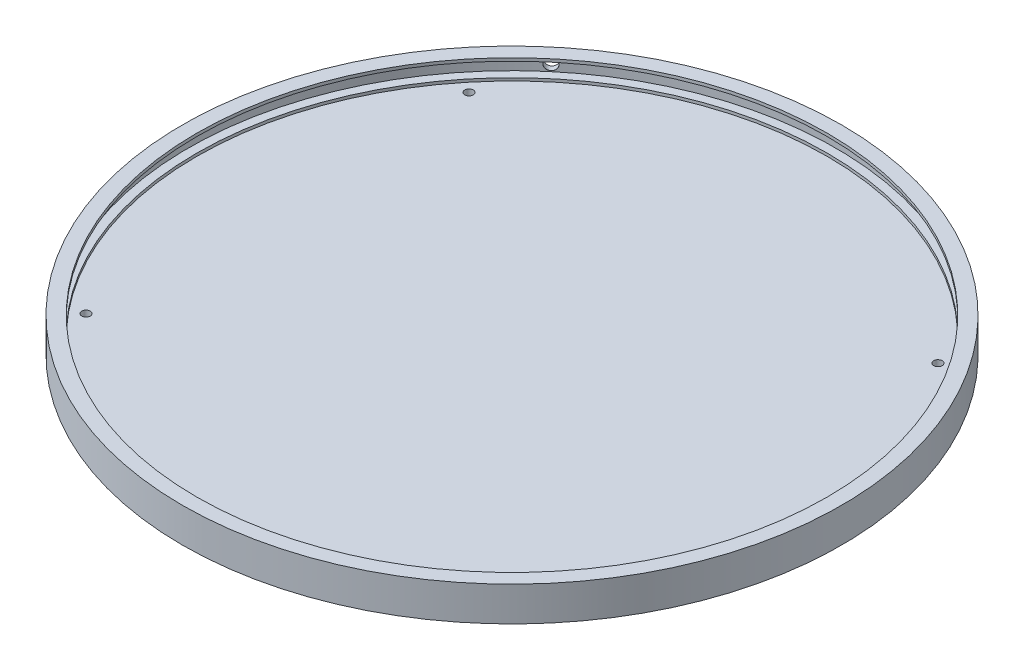
ISO-10303-21;
HEADER;
FILE_DESCRIPTION(('STEP AP214'),'2;1');
FILE_NAME('part.step','',(''),(''),'','','');
FILE_SCHEMA(('AUTOMOTIVE_DESIGN { 1 0 10303 214 1 1 1 1 }'));
ENDSEC;
DATA;
#1=APPLICATION_CONTEXT('core data for automotive mechanical design processes');
#2=APPLICATION_PROTOCOL_DEFINITION('international standard','automotive_design',2000,#1);
#3=PRODUCT_CONTEXT('',#1,'mechanical');
#4=PRODUCT('Part','Part','',(#3));
#5=PRODUCT_RELATED_PRODUCT_CATEGORY('part','',(#4));
#6=PRODUCT_DEFINITION_FORMATION('','',#4);
#7=PRODUCT_DEFINITION_CONTEXT('part definition',#1,'design');
#8=PRODUCT_DEFINITION('design','',#6,#7);
#9=PRODUCT_DEFINITION_SHAPE('','',#8);
#10=(LENGTH_UNIT() NAMED_UNIT(*) SI_UNIT(.MILLI.,.METRE.));
#11=(NAMED_UNIT(*) PLANE_ANGLE_UNIT() SI_UNIT($,.RADIAN.));
#12=(NAMED_UNIT(*) SI_UNIT($,.STERADIAN.) SOLID_ANGLE_UNIT());
#13=UNCERTAINTY_MEASURE_WITH_UNIT(LENGTH_MEASURE(1.E-05),#10,'distance_accuracy_value','');
#14=(GEOMETRIC_REPRESENTATION_CONTEXT(3) GLOBAL_UNCERTAINTY_ASSIGNED_CONTEXT((#13)) GLOBAL_UNIT_ASSIGNED_CONTEXT((#10,
#11,#12)) REPRESENTATION_CONTEXT('',''));
#15=CARTESIAN_POINT('',(0.,0.,0.));
#16=DIRECTION('',(0.,0.,1.));
#17=DIRECTION('',(1.,0.,0.));
#18=AXIS2_PLACEMENT_3D('',#15,#16,#17);
#19=CARTESIAN_POINT('',(0.,12.0332613302071,0.));
#20=DIRECTION('',(0.,-1.,0.));
#21=DIRECTION('',(0.,0.,-1.));
#22=AXIS2_PLACEMENT_3D('',#19,#20,#21);
#23=CYLINDRICAL_SURFACE('',#22,110.);
#24=CARTESIAN_POINT('',(0.,5.,0.));
#25=DIRECTION('',(0.,1.,0.));
#26=DIRECTION('',(0.,0.,1.));
#27=AXIS2_PLACEMENT_3D('',#24,#25,#26);
#28=CIRCLE('',#27,110.);
#29=CARTESIAN_POINT('',(0.,5.,110.));
#30=VERTEX_POINT('',#29);
#31=EDGE_CURVE('E12',#30,#30,#28,.T.);
#32=ORIENTED_EDGE('',*,*,#31,.F.);
#33=EDGE_LOOP('',(#32));
#34=FACE_BOUND('',#33,.T.);
#35=CARTESIAN_POINT('',(0.,6.,0.));
#36=DIRECTION('',(0.,1.,0.));
#37=DIRECTION('',(0.,0.,1.));
#38=AXIS2_PLACEMENT_3D('',#35,#36,#37);
#39=CIRCLE('',#38,110.);
#40=CARTESIAN_POINT('',(0.,6.,110.));
#41=VERTEX_POINT('',#40);
#42=EDGE_CURVE('E131',#41,#41,#39,.T.);
#43=ORIENTED_EDGE('',*,*,#42,.T.);
#44=EDGE_LOOP('',(#43));
#45=FACE_BOUND('',#44,.T.);
#46=ADVANCED_FACE('F50',(#34,#45),#23,.F.);
#47=CARTESIAN_POINT('',(0.,11.,0.));
#48=DIRECTION('',(0.,1.,0.));
#49=DIRECTION('',(0.,0.,1.));
#50=AXIS2_PLACEMENT_3D('',#47,#48,#49);
#51=CIRCLE('',#50,110.);
#52=CARTESIAN_POINT('',(0.,11.,110.));
#53=VERTEX_POINT('',#52);
#54=EDGE_CURVE('E134',#53,#53,#51,.T.);
#55=ORIENTED_EDGE('',*,*,#54,.F.);
#56=EDGE_LOOP('',(#55));
#57=FACE_BOUND('',#56,.T.);
#58=CARTESIAN_POINT('',(0.,12.0332613302071,0.));
#59=DIRECTION('',(0.,1.,0.));
#60=DIRECTION('',(0.,0.,1.));
#61=AXIS2_PLACEMENT_3D('',#58,#59,#60);
#62=CIRCLE('',#61,110.);
#63=CARTESIAN_POINT('',(0.,12.0332613302071,110.));
#64=VERTEX_POINT('',#63);
#65=EDGE_CURVE('E146',#64,#64,#62,.T.);
#66=ORIENTED_EDGE('',*,*,#65,.T.);
#67=EDGE_LOOP('',(#66));
#68=FACE_BOUND('',#67,.T.);
#69=ADVANCED_FACE('F52',(#57,#68),#23,.F.);
#70=CARTESIAN_POINT('',(0.,12.0332613302071,0.));
#71=DIRECTION('',(0.,-1.,0.));
#72=DIRECTION('',(0.,0.,-1.));
#73=AXIS2_PLACEMENT_3D('',#70,#71,#72);
#74=CYLINDRICAL_SURFACE('',#73,115.);
#75=CARTESIAN_POINT('',(-72.5635949649901,8.29805204726436,-89.2161682978868));
#76=CARTESIAN_POINT('',(-72.5635989235966,8.41038381068899,-89.2161652694946));
#77=CARTESIAN_POINT('',(-72.570963463125,8.52279680903081,-89.2101767274284));
#78=CARTESIAN_POINT('',(-72.6002307960804,8.74452626790636,-89.1863601151986));
#79=CARTESIAN_POINT('',(-72.6221510438443,8.8538388463064,-89.1685178307214));
#80=CARTESIAN_POINT('',(-72.6798788584181,9.06612311536384,-89.1214709692371));
#81=CARTESIAN_POINT('',(-72.715679738066,9.1690978317243,-89.0922718634944));
#82=CARTESIAN_POINT('',(-72.8001030018828,9.36580199428538,-89.0233000935605));
#83=CARTESIAN_POINT('',(-72.8487222174628,9.45953371742233,-88.9835300424016));
#84=CARTESIAN_POINT('',(-72.9573674624024,9.63514368314188,-88.8944736912287));
#85=CARTESIAN_POINT('',(-73.0173957611737,9.71701956172777,-88.8451854979038));
#86=CARTESIAN_POINT('',(-73.1470983020891,9.86657422343615,-88.73843051225));
#87=CARTESIAN_POINT('',(-73.216772924644,9.93425244639733,-88.680963397376));
#88=CARTESIAN_POINT('',(-73.3637407365249,10.0534897237456,-88.5594186119919));
#89=CARTESIAN_POINT('',(-73.4410342663039,10.1050480573809,-88.4953406460681));
#90=CARTESIAN_POINT('',(-73.6009993860438,10.1905770204827,-88.3623432112762));
#91=CARTESIAN_POINT('',(-73.6836709615802,10.2245476971185,-88.2934237553932));
#92=CARTESIAN_POINT('',(-73.852005731904,10.2739338756188,-88.1526702863767));
#93=CARTESIAN_POINT('',(-73.9376686247584,10.2893512446499,-88.0808365672808));
#94=CARTESIAN_POINT('',(-74.1095469782745,10.3011988917976,-87.9362704200492));
#95=CARTESIAN_POINT('',(-74.1957624375337,10.297629218091,-87.8635379941942));
#96=CARTESIAN_POINT('',(-74.3662923001249,10.2716057613346,-87.7192512880254));
#97=CARTESIAN_POINT('',(-74.4506069074992,10.2491540151413,-87.6476968814845));
#98=CARTESIAN_POINT('',(-74.6149726766387,10.1860068745975,-87.5078139745733));
#99=CARTESIAN_POINT('',(-74.6950238322612,10.1453114539624,-87.4394854788509));
#100=CARTESIAN_POINT('',(-74.8486314681472,10.04682983828,-87.30803284228));
#101=CARTESIAN_POINT('',(-74.9221875932126,9.98904270927773,-87.2449089860737));
#102=CARTESIAN_POINT('',(-75.0607607281884,9.85801878336727,-87.1257170173518));
#103=CARTESIAN_POINT('',(-75.125777733833,9.78478197874141,-87.0696489083608));
#104=CARTESIAN_POINT('',(-75.2454892629179,9.6249260837371,-86.9662153891914));
#105=CARTESIAN_POINT('',(-75.3001824170989,9.53830522098897,-86.9188511334328));
#106=CARTESIAN_POINT('',(-75.3977362843162,9.35414635305779,-86.8342417860159));
#107=CARTESIAN_POINT('',(-75.4405969956926,9.25660834634338,-86.7969966957771));
#108=CARTESIAN_POINT('',(-75.5133160288148,9.05338301507061,-86.733738744921));
#109=CARTESIAN_POINT('',(-75.5431743096194,8.94769566485346,-86.7077259196711));
#110=CARTESIAN_POINT('',(-75.5890754854831,8.73117222153215,-86.667713724728));
#111=CARTESIAN_POINT('',(-75.6051183935978,8.62033613329366,-86.6537143436822));
#112=CARTESIAN_POINT('',(-75.6229517544795,8.39667706107066,-86.6381515914718));
#113=CARTESIAN_POINT('',(-75.6247440745613,8.28385433934493,-86.6365865909777));
#114=CARTESIAN_POINT('',(-75.6140325175079,8.05941101329623,-86.6459354790611));
#115=CARTESIAN_POINT('',(-75.6015286455074,7.94779040854152,-86.6568493631566));
#116=CARTESIAN_POINT('',(-75.5625655069265,7.72892676984514,-86.6908262459352));
#117=CARTESIAN_POINT('',(-75.536107087094,7.62168347071838,-86.7138885074671));
#118=CARTESIAN_POINT('',(-75.4699549162047,7.41461061733282,-86.7714689100171));
#119=CARTESIAN_POINT('',(-75.430261157327,7.31478106745496,-86.8059870578046));
#120=CARTESIAN_POINT('',(-75.3387158028832,7.12535813659385,-86.8854508036189));
#121=CARTESIAN_POINT('',(-75.286862940309,7.03576582380348,-86.9303974883194));
#122=CARTESIAN_POINT('',(-75.1724210924742,6.86937130822063,-87.0293790358896));
#123=CARTESIAN_POINT('',(-75.1098320951295,6.7925691198241,-87.0834139089885));
#124=CARTESIAN_POINT('',(-74.9756328820637,6.65392678979911,-87.1989810785048));
#125=CARTESIAN_POINT('',(-74.9040217029311,6.59208824808918,-87.2605141755784));
#126=CARTESIAN_POINT('',(-74.7537663914675,6.48513958541108,-87.3892681394775));
#127=CARTESIAN_POINT('',(-74.6751222693986,6.44002944003402,-87.4564889980036));
#128=CARTESIAN_POINT('',(-74.5129985966574,6.36782085625959,-87.5946595056729));
#129=CARTESIAN_POINT('',(-74.4295193264602,6.34072137424307,-87.6656089385085));
#130=CARTESIAN_POINT('',(-74.2600660212105,6.30529993731935,-87.8091961166282));
#131=CARTESIAN_POINT('',(-74.1740919839068,6.2969779993575,-87.8818338634358));
#132=CARTESIAN_POINT('',(-74.0020941748441,6.29934805671065,-88.0267158305666));
#133=CARTESIAN_POINT('',(-73.9160704112714,6.31003751006908,-88.0989601022048));
#134=CARTESIAN_POINT('',(-73.7464136542782,6.35012173144914,-88.241026286566));
#135=CARTESIAN_POINT('',(-73.6627806656448,6.37951653692109,-88.3108481944389));
#136=CARTESIAN_POINT('',(-73.5003049925301,6.4561771527932,-88.4461211718779));
#137=CARTESIAN_POINT('',(-73.4214623954848,6.50344328927355,-88.5115721616665));
#138=CARTESIAN_POINT('',(-73.2708502357115,6.6145026323688,-88.6362909779077));
#139=CARTESIAN_POINT('',(-73.1990804027862,6.67829520729414,-88.6955590405686));
#140=CARTESIAN_POINT('',(-73.0646947761076,6.82059893412094,-88.8062946692415));
#141=CARTESIAN_POINT('',(-73.0020792322821,6.89911048774201,-88.8577620222823));
#142=CARTESIAN_POINT('',(-72.8878202300001,7.06864864136574,-88.9515100500556));
#143=CARTESIAN_POINT('',(-72.8361794990318,7.15967834317367,-88.9937884411832));
#144=CARTESIAN_POINT('',(-72.7453842025782,7.35169124324113,-89.0680219231043));
#145=CARTESIAN_POINT('',(-72.7062363273568,7.4526797369391,-89.0999714826466));
#146=CARTESIAN_POINT('',(-72.6416554112652,7.66162831659262,-89.1526312113996));
#147=CARTESIAN_POINT('',(-72.6162059581192,7.76957988546883,-89.1733548307611));
#148=CARTESIAN_POINT('',(-72.5865450193335,7.94818985035567,-89.1974981851991));
#149=CARTESIAN_POINT('',(-72.5779498987048,8.01768808814614,-89.2044911658375));
#150=CARTESIAN_POINT('',(-72.5664736329422,8.15746429141074,-89.2138271697081));
#151=CARTESIAN_POINT('',(-72.5635924872511,8.22774225680884,-89.2161701933937));
#152=CARTESIAN_POINT('',(-72.5635949649901,8.29805204726436,-89.2161682978868));
#153=B_SPLINE_CURVE_WITH_KNOTS('',3,(#75,#76,#77,#78,#79,#80,#81,#82,#83,#84,#85,#86,#87,#88,
#89,#90,#91,#92,#93,#94,#95,#96,#97,#98,#99,#100,#101,#102,#103,#104,#105,#106,#107,#108,#109,
#110,#111,#112,#113,#114,#115,#116,#117,#118,#119,#120,#121,#122,#123,#124,#125,#126,#127,#128,
#129,#130,#131,#132,#133,#134,#135,#136,#137,#138,#139,#140,#141,#142,#143,#144,#145,#146,#147,
#148,#149,#150,#151,#152),.UNSPECIFIED.,.T.,.F.,(4,2,2,2,2,2,2,2,2,2,2,2,2,2,2,2,2,2,2,2,2,2,2,
2,2,2,2,2,2,2,2,2,2,2,2,2,2,2,4),(0.,0.336738656596466,0.673881841059908,1.01086280413937,
1.34776054622602,1.68472537182542,2.0217034897021,2.3586966723787,2.69568895125095,
3.03264731307801,3.36960481992393,3.70652598297935,4.04344763145688,4.38038769399659,
4.71732792485054,5.05431281295757,5.39129774833425,5.72828374477538,6.06526942276406,
6.40221094336563,6.73915234294744,7.07607329962076,7.41299445538696,7.74995073476732,
8.08690739340715,8.42390006367216,8.76089224221924,9.09786489221519,9.43483784630417,
9.77176574812935,10.1086943245261,10.4456290488162,10.78255089636,11.1194819407257,
11.456496622377,11.7936914828569,12.1304814409654,12.3412502028026,12.5520189440898),.UNSPECIFIED.);
#154=CARTESIAN_POINT('',(-72.5635949649901,8.29805204726436,-89.2161682978868));
#155=VERTEX_POINT('',#154);
#156=EDGE_CURVE('E54',#155,#155,#153,.T.);
#157=ORIENTED_EDGE('',*,*,#156,.T.);
#158=EDGE_LOOP('',(#157));
#159=FACE_BOUND('',#158,.T.);
#160=CARTESIAN_POINT('',(0.,12.0332613302071,0.));
#161=DIRECTION('',(0.,1.,0.));
#162=DIRECTION('',(0.,0.,1.));
#163=AXIS2_PLACEMENT_3D('',#160,#161,#162);
#164=CIRCLE('',#163,115.);
#165=CARTESIAN_POINT('',(0.,12.0332613302071,115.));
#166=VERTEX_POINT('',#165);
#167=EDGE_CURVE('E64',#166,#166,#164,.T.);
#168=ORIENTED_EDGE('',*,*,#167,.F.);
#169=EDGE_LOOP('',(#168));
#170=FACE_BOUND('',#169,.T.);
#171=CARTESIAN_POINT('',(0.,0.,0.));
#172=DIRECTION('',(0.,1.,0.));
#173=DIRECTION('',(0.,0.,1.));
#174=AXIS2_PLACEMENT_3D('',#171,#172,#173);
#175=CIRCLE('',#174,115.);
#176=CARTESIAN_POINT('',(0.,0.,115.));
#177=VERTEX_POINT('',#176);
#178=EDGE_CURVE('E142',#177,#177,#175,.T.);
#179=ORIENTED_EDGE('',*,*,#178,.T.);
#180=EDGE_LOOP('',(#179));
#181=FACE_BOUND('',#180,.T.);
#182=ADVANCED_FACE('F125',(#159,#170,#181),#74,.T.);
#183=CARTESIAN_POINT('',(0.,12.0332613302071,0.));
#184=DIRECTION('',(0.,1.,0.));
#185=DIRECTION('',(0.,0.,1.));
#186=AXIS2_PLACEMENT_3D('',#183,#184,#185);
#187=PLANE('',#186);
#188=ORIENTED_EDGE('',*,*,#65,.F.);
#189=EDGE_LOOP('',(#188));
#190=FACE_BOUND('',#189,.T.);
#191=ORIENTED_EDGE('',*,*,#167,.T.);
#192=EDGE_LOOP('',(#191));
#193=FACE_BOUND('',#192,.T.);
#194=ADVANCED_FACE('F219',(#190,#193),#187,.T.);
#195=CARTESIAN_POINT('',(0.,0.,0.));
#196=DIRECTION('',(0.,1.,0.));
#197=DIRECTION('',(0.,0.,1.));
#198=AXIS2_PLACEMENT_3D('',#195,#196,#197);
#199=PLANE('',#198);
#200=ORIENTED_EDGE('',*,*,#178,.F.);
#201=EDGE_LOOP('',(#200));
#202=FACE_BOUND('',#201,.T.);
#203=CARTESIAN_POINT('',(81.8198051533947,0.,-66.8198051533948));
#204=DIRECTION('',(0.,1.,0.));
#205=DIRECTION('',(0.,0.,1.));
#206=AXIS2_PLACEMENT_3D('',#203,#204,#205);
#207=CIRCLE('',#206,1.5);
#208=CARTESIAN_POINT('',(81.8198051533947,0.,-65.3198051533948));
#209=VERTEX_POINT('',#208);
#210=EDGE_CURVE('E139',#209,#209,#207,.T.);
#211=ORIENTED_EDGE('',*,*,#210,.T.);
#212=EDGE_LOOP('',(#211));
#213=FACE_BOUND('',#212,.T.);
#214=CARTESIAN_POINT('',(83.8198051533948,0.,66.8198051533947));
#215=DIRECTION('',(0.,1.,0.));
#216=DIRECTION('',(0.,0.,1.));
#217=AXIS2_PLACEMENT_3D('',#214,#215,#216);
#218=CIRCLE('',#217,1.50000000000002);
#219=CARTESIAN_POINT('',(83.8198051533948,0.,68.3198051533947));
#220=VERTEX_POINT('',#219);
#221=EDGE_CURVE('E163',#220,#220,#218,.T.);
#222=ORIENTED_EDGE('',*,*,#221,.T.);
#223=EDGE_LOOP('',(#222));
#224=FACE_BOUND('',#223,.T.);
#225=CARTESIAN_POINT('',(-81.8198051533947,0.,66.8198051533948));
#226=DIRECTION('',(0.,1.,0.));
#227=DIRECTION('',(0.,0.,1.));
#228=AXIS2_PLACEMENT_3D('',#225,#226,#227);
#229=CIRCLE('',#228,1.50000000000003);
#230=CARTESIAN_POINT('',(-81.8198051533947,0.,68.3198051533948));
#231=VERTEX_POINT('',#230);
#232=EDGE_CURVE('E159',#231,#231,#229,.T.);
#233=ORIENTED_EDGE('',*,*,#232,.T.);
#234=EDGE_LOOP('',(#233));
#235=FACE_BOUND('',#234,.T.);
#236=CARTESIAN_POINT('',(-81.8198051533948,0.,-66.8198051533947));
#237=DIRECTION('',(0.,1.,0.));
#238=DIRECTION('',(0.,0.,1.));
#239=AXIS2_PLACEMENT_3D('',#236,#237,#238);
#240=CIRCLE('',#239,1.50000000000001);
#241=CARTESIAN_POINT('',(-81.8198051533948,0.,-65.3198051533947));
#242=VERTEX_POINT('',#241);
#243=EDGE_CURVE('E154',#242,#242,#240,.T.);
#244=ORIENTED_EDGE('',*,*,#243,.T.);
#245=EDGE_LOOP('',(#244));
#246=FACE_BOUND('',#245,.T.);
#247=ADVANCED_FACE('F207',(#202,#213,#224,#235,#246),#199,.F.);
#248=CARTESIAN_POINT('',(-81.8198051533948,5.,-66.8198051533947));
#249=DIRECTION('',(0.,-1.,0.));
#250=DIRECTION('',(0.,0.,-1.));
#251=AXIS2_PLACEMENT_3D('',#248,#249,#250);
#252=CYLINDRICAL_SURFACE('',#251,1.50000000000001);
#253=CARTESIAN_POINT('',(-81.8198051533948,5.,-66.8198051533947));
#254=DIRECTION('',(0.,1.,0.));
#255=DIRECTION('',(0.,0.,1.));
#256=AXIS2_PLACEMENT_3D('',#253,#254,#255);
#257=CIRCLE('',#256,1.50000000000001);
#258=CARTESIAN_POINT('',(-81.8198051533948,5.,-65.3198051533947));
#259=VERTEX_POINT('',#258);
#260=EDGE_CURVE('E147',#259,#259,#257,.T.);
#261=ORIENTED_EDGE('',*,*,#260,.T.);
#262=EDGE_LOOP('',(#261));
#263=FACE_BOUND('',#262,.T.);
#264=ORIENTED_EDGE('',*,*,#243,.F.);
#265=EDGE_LOOP('',(#264));
#266=FACE_BOUND('',#265,.T.);
#267=ADVANCED_FACE('F203',(#263,#266),#252,.F.);
#268=CARTESIAN_POINT('',(-81.8198051533947,5.,66.8198051533948));
#269=DIRECTION('',(0.,-1.,0.));
#270=DIRECTION('',(0.,0.,-1.));
#271=AXIS2_PLACEMENT_3D('',#268,#269,#270);
#272=CYLINDRICAL_SURFACE('',#271,1.50000000000003);
#273=CARTESIAN_POINT('',(-81.8198051533947,5.,66.8198051533948));
#274=DIRECTION('',(0.,1.,0.));
#275=DIRECTION('',(0.,0.,1.));
#276=AXIS2_PLACEMENT_3D('',#273,#274,#275);
#277=CIRCLE('',#276,1.50000000000003);
#278=CARTESIAN_POINT('',(-81.8198051533947,5.,68.3198051533948));
#279=VERTEX_POINT('',#278);
#280=EDGE_CURVE('E173',#279,#279,#277,.T.);
#281=ORIENTED_EDGE('',*,*,#280,.T.);
#282=EDGE_LOOP('',(#281));
#283=FACE_BOUND('',#282,.T.);
#284=ORIENTED_EDGE('',*,*,#232,.F.);
#285=EDGE_LOOP('',(#284));
#286=FACE_BOUND('',#285,.T.);
#287=ADVANCED_FACE('F206',(#283,#286),#272,.F.);
#288=CARTESIAN_POINT('',(83.8198051533948,5.,66.8198051533947));
#289=DIRECTION('',(0.,-1.,0.));
#290=DIRECTION('',(0.,0.,-1.));
#291=AXIS2_PLACEMENT_3D('',#288,#289,#290);
#292=CYLINDRICAL_SURFACE('',#291,1.50000000000002);
#293=CARTESIAN_POINT('',(83.8198051533948,5.,66.8198051533947));
#294=DIRECTION('',(0.,1.,0.));
#295=DIRECTION('',(0.,0.,1.));
#296=AXIS2_PLACEMENT_3D('',#293,#294,#295);
#297=CIRCLE('',#296,1.50000000000002);
#298=CARTESIAN_POINT('',(83.8198051533948,5.,68.3198051533947));
#299=VERTEX_POINT('',#298);
#300=EDGE_CURVE('E177',#299,#299,#297,.T.);
#301=ORIENTED_EDGE('',*,*,#300,.T.);
#302=EDGE_LOOP('',(#301));
#303=FACE_BOUND('',#302,.T.);
#304=ORIENTED_EDGE('',*,*,#221,.F.);
#305=EDGE_LOOP('',(#304));
#306=FACE_BOUND('',#305,.T.);
#307=ADVANCED_FACE('F211',(#303,#306),#292,.F.);
#308=CARTESIAN_POINT('',(81.8198051533947,5.,-66.8198051533948));
#309=DIRECTION('',(0.,-1.,0.));
#310=DIRECTION('',(0.,0.,-1.));
#311=AXIS2_PLACEMENT_3D('',#308,#309,#310);
#312=CYLINDRICAL_SURFACE('',#311,1.5);
#313=CARTESIAN_POINT('',(81.8198051533947,5.,-66.8198051533948));
#314=DIRECTION('',(0.,1.,0.));
#315=DIRECTION('',(0.,0.,1.));
#316=AXIS2_PLACEMENT_3D('',#313,#314,#315);
#317=CIRCLE('',#316,1.5);
#318=CARTESIAN_POINT('',(81.8198051533947,5.,-65.3198051533948));
#319=VERTEX_POINT('',#318);
#320=EDGE_CURVE('E158',#319,#319,#317,.T.);
#321=ORIENTED_EDGE('',*,*,#320,.T.);
#322=EDGE_LOOP('',(#321));
#323=FACE_BOUND('',#322,.T.);
#324=ORIENTED_EDGE('',*,*,#210,.F.);
#325=EDGE_LOOP('',(#324));
#326=FACE_BOUND('',#325,.T.);
#327=ADVANCED_FACE('F198',(#323,#326),#312,.F.);
#328=CARTESIAN_POINT('',(0.,5.,0.));
#329=DIRECTION('',(0.,1.,0.));
#330=DIRECTION('',(0.,0.,1.));
#331=AXIS2_PLACEMENT_3D('',#328,#329,#330);
#332=PLANE('',#331);
#333=ORIENTED_EDGE('',*,*,#320,.F.);
#334=EDGE_LOOP('',(#333));
#335=FACE_BOUND('',#334,.T.);
#336=ORIENTED_EDGE('',*,*,#300,.F.);
#337=EDGE_LOOP('',(#336));
#338=FACE_BOUND('',#337,.T.);
#339=ORIENTED_EDGE('',*,*,#280,.F.);
#340=EDGE_LOOP('',(#339));
#341=FACE_BOUND('',#340,.T.);
#342=ORIENTED_EDGE('',*,*,#260,.F.);
#343=EDGE_LOOP('',(#342));
#344=FACE_BOUND('',#343,.T.);
#345=ORIENTED_EDGE('',*,*,#31,.T.);
#346=EDGE_LOOP('',(#345));
#347=FACE_BOUND('',#346,.T.);
#348=ADVANCED_FACE('F191',(#335,#338,#341,#344,#347),#332,.T.);
#349=CARTESIAN_POINT('',(0.,11.,0.));
#350=DIRECTION('',(0.,-1.,0.));
#351=DIRECTION('',(0.,0.,-1.));
#352=AXIS2_PLACEMENT_3D('',#349,#350,#351);
#353=CYLINDRICAL_SURFACE('',#352,113.);
#354=CARTESIAN_POINT('',(-72.8154371706679,6.27305204726436,-86.4112961923643));
#355=CARTESIAN_POINT('',(-72.7284633991949,6.27305708790266,-86.4845852851125));
#356=CARTESIAN_POINT('',(-72.6413152201899,6.28266622396848,-86.5577950256487));
#357=CARTESIAN_POINT('',(-72.4692049907876,6.3208652534552,-86.7019432986068));
#358=CARTESIAN_POINT('',(-72.3842456919224,6.34947793119307,-86.7728789974146));
#359=CARTESIAN_POINT('',(-72.2190618054103,6.42486864241678,-86.9104059232508));
#360=CARTESIAN_POINT('',(-72.1388349581531,6.47163792443307,-86.9769992252774));
#361=CARTESIAN_POINT('',(-71.9854208403437,6.58200202402494,-87.1040132100902));
#362=CARTESIAN_POINT('',(-71.9122318368453,6.64559268508973,-87.1644354126309));
#363=CARTESIAN_POINT('',(-71.774981646761,6.78781483313225,-87.2774881072696));
#364=CARTESIAN_POINT('',(-71.7109223337377,6.86644939963358,-87.3301170001387));
#365=CARTESIAN_POINT('',(-71.5938216993491,7.03652307465244,-87.4261427951229));
#366=CARTESIAN_POINT('',(-71.5407808128426,7.12796268830211,-87.4695393328708));
#367=CARTESIAN_POINT('',(-71.4472771904425,7.32105415001373,-87.5459321787945));
#368=CARTESIAN_POINT('',(-71.4068150665292,7.42270649462582,-87.5789279809562));
#369=CARTESIAN_POINT('',(-71.3396674959999,7.63333419984546,-87.6336335437255));
#370=CARTESIAN_POINT('',(-71.3129820118596,7.74230954050604,-87.6553433350735));
#371=CARTESIAN_POINT('',(-71.2741801867236,7.9644775570191,-87.6868968016188));
#372=CARTESIAN_POINT('',(-71.2620622874681,8.077669780466,-87.6967417459708));
#373=CARTESIAN_POINT('',(-71.2527500640575,8.30506850437168,-87.7043080240632));
#374=CARTESIAN_POINT('',(-71.2555557013529,8.4192750022097,-87.7020293891202));
#375=CARTESIAN_POINT('',(-71.2760059766478,8.6454467048101,-87.6854100859777));
#376=CARTESIAN_POINT('',(-71.2936489140989,8.75741216491909,-87.6710708000861));
#377=CARTESIAN_POINT('',(-71.3432484145553,8.97593749399464,-87.6307133336558));
#378=CARTESIAN_POINT('',(-71.3752049985307,9.08249735504153,-87.604695136007));
#379=CARTESIAN_POINT('',(-71.4524887612576,9.2871935568803,-87.5416719266834));
#380=CARTESIAN_POINT('',(-71.4978167164388,9.3853294080915,-87.5046662770042));
#381=CARTESIAN_POINT('',(-71.600506430123,9.57038643408274,-87.4206603988523));
#382=CARTESIAN_POINT('',(-71.6578681953084,9.65730760263517,-87.3736601648296));
#383=CARTESIAN_POINT('',(-71.7829512991509,9.81748068033176,-87.2709255020431));
#384=CARTESIAN_POINT('',(-71.8506740947537,9.8907306638426,-87.2151898448959));
#385=CARTESIAN_POINT('',(-71.9944962420765,10.0214672217865,-87.0965050317668));
#386=CARTESIAN_POINT('',(-72.0705955949741,10.0789537940032,-87.0335558747706));
#387=CARTESIAN_POINT('',(-72.2289625234098,10.1765314331323,-86.9021722745634));
#388=CARTESIAN_POINT('',(-72.3112301193938,10.2166224423805,-86.8337378131703));
#389=CARTESIAN_POINT('',(-72.4795608857076,10.2782696823072,-86.6932826767768));
#390=CARTESIAN_POINT('',(-72.5656240522417,10.2998259315214,-86.621262005363));
#391=CARTESIAN_POINT('',(-72.7390692453922,10.3237893866718,-86.4756649046249));
#392=CARTESIAN_POINT('',(-72.8264510868907,10.3261992558106,-86.4020886930992));
#393=CARTESIAN_POINT('',(-73.0000620786039,10.3118084787722,-86.2554569224745));
#394=CARTESIAN_POINT('',(-73.0862912292614,10.2950078399747,-86.1824013631755));
#395=CARTESIAN_POINT('',(-73.255159777791,10.2426751661635,-86.0389089243426));
#396=CARTESIAN_POINT('',(-73.3377994064638,10.2071443374068,-85.9684718764847));
#397=CARTESIAN_POINT('',(-73.4971829502717,10.1183611189094,-85.8322497643168));
#398=CARTESIAN_POINT('',(-73.5739268616633,10.0651087179166,-85.7664647029607));
#399=CARTESIAN_POINT('',(-73.7193961326947,9.94238715312546,-85.6414610218523));
#400=CARTESIAN_POINT('',(-73.7881206042196,9.87291619575086,-85.5822431294187));
#401=CARTESIAN_POINT('',(-73.915645663917,9.71973219402379,-85.47212667801));
#402=CARTESIAN_POINT('',(-73.9744462404738,9.63601913300151,-85.4212281287725));
#403=CARTESIAN_POINT('',(-74.0805171298241,9.45671586794894,-85.3292559742697));
#404=CARTESIAN_POINT('',(-74.1277861336453,9.36112431742418,-85.2881834843907));
#405=CARTESIAN_POINT('',(-74.2094947147246,9.16078457146335,-85.2170982828524));
#406=CARTESIAN_POINT('',(-74.2439343110216,9.05603638961614,-85.1870855547804));
#407=CARTESIAN_POINT('',(-74.2990454522991,8.84036331516326,-85.1390227288076));
#408=CARTESIAN_POINT('',(-74.3197178434979,8.72943880264767,-85.1209718956545));
#409=CARTESIAN_POINT('',(-74.3467367801141,8.50455632116445,-85.0973739712513));
#410=CARTESIAN_POINT('',(-74.3530833134078,8.39059834962975,-85.0918268905829));
#411=CARTESIAN_POINT('',(-74.3512785194763,8.16290130819718,-85.0934038783496));
#412=CARTESIAN_POINT('',(-74.3431292492191,8.04916220953373,-85.1005261489921));
#413=CARTESIAN_POINT('',(-74.3125577649746,7.8251152371238,-85.1272234054061));
#414=CARTESIAN_POINT('',(-74.2901355224145,7.71480737024673,-85.1467984161067));
#415=CARTESIAN_POINT('',(-74.2316262364058,7.50075195172008,-85.1978119596132));
#416=CARTESIAN_POINT('',(-74.1955389440602,7.39700451960328,-85.2292507085069));
#417=CARTESIAN_POINT('',(-74.1106828621574,7.19901973715764,-85.3030470347303));
#418=CARTESIAN_POINT('',(-74.061914556486,7.10478202414456,-85.3454041954316));
#419=CARTESIAN_POINT('',(-73.9530261056768,6.92848231597178,-85.4397747305378));
#420=CARTESIAN_POINT('',(-73.8929055576883,6.84642075308484,-85.4917884476185));
#421=CARTESIAN_POINT('',(-73.7629439514314,6.69678630129117,-85.6039452973601));
#422=CARTESIAN_POINT('',(-73.6931004841124,6.62921701371369,-85.6640904446411));
#423=CARTESIAN_POINT('',(-73.5456044320824,6.51048080649085,-85.7907542655564));
#424=CARTESIAN_POINT('',(-73.4679476651716,6.45932273324249,-85.8572763516452));
#425=CARTESIAN_POINT('',(-73.3070726581267,6.37495838689554,-85.9946756570795));
#426=CARTESIAN_POINT('',(-73.2238612074003,6.34173063347386,-86.0655475514773));
#427=CARTESIAN_POINT('',(-73.0860031593776,6.30300815198192,-86.1826027591915));
#428=CARTESIAN_POINT('',(-73.0323168609388,6.291788673397,-86.2281027342311));
#429=CARTESIAN_POINT('',(-72.9242555453566,6.27680904376897,-86.3195109015594));
#430=CARTESIAN_POINT('',(-72.8698805282843,6.27304889195364,-86.3654190938058));
#431=CARTESIAN_POINT('',(-72.8154371706679,6.27305204726436,-86.4112961923643));
#432=B_SPLINE_CURVE_WITH_KNOTS('',3,(#354,#355,#356,#357,#358,#359,#360,#361,#362,#363,#364,
#365,#366,#367,#368,#369,#370,#371,#372,#373,#374,#375,#376,#377,#378,#379,#380,#381,#382,#383,
#384,#385,#386,#387,#388,#389,#390,#391,#392,#393,#394,#395,#396,#397,#398,#399,#400,#401,#402,
#403,#404,#405,#406,#407,#408,#409,#410,#411,#412,#413,#414,#415,#416,#417,#418,#419,#420,#421,
#422,#423,#424,#425,#426,#427,#428,#429,#430,#431),.UNSPECIFIED.,.T.,.F.,(4,2,2,2,2,2,2,2,2,2,2,
2,2,2,2,2,2,2,2,2,2,2,2,2,2,2,2,2,2,2,2,2,2,2,2,2,2,2,4),(0.,0.340946159833192,
0.682301837145875,1.02349318515213,1.36460030445589,1.70577732406358,2.04696780617932,
2.38817488525122,2.72938103495291,3.07055068339713,3.4117194505579,3.75284912065292,
4.09397929051747,4.43512927254181,4.77627944400848,5.11747763144245,5.45867586685003,
5.79987523327942,6.14107425849044,6.48222582313377,6.82337725672085,7.16450672224103,
7.50563640435509,7.84680382917099,8.18797165331276,8.52917818611131,8.87038421255311,
9.21156926440685,9.55275460499775,9.89389153493558,10.2350291477937,10.5761729744761,
10.9173037856019,11.2584467045198,11.5996742994564,11.941085523833,12.282086828195,
12.4955104306784,12.7089340110678),.UNSPECIFIED.);
#433=CARTESIAN_POINT('',(-72.8154371706679,10.3230520472644,-86.4112961923643));
#434=VERTEX_POINT('',#433);
#435=CARTESIAN_POINT('',(-72.8154371706679,6.27305204726436,-86.4112961923643));
#436=VERTEX_POINT('',#435);
#437=EDGE_CURVE('E79',#434,#436,#432,.T.);
#438=ORIENTED_EDGE('',*,*,#437,.F.);
#439=EDGE_CURVE('E82',#436,#434,#432,.T.);
#440=ORIENTED_EDGE('',*,*,#439,.F.);
#441=EDGE_LOOP('',(#438,#440));
#442=FACE_BOUND('',#441,.T.);
#443=CARTESIAN_POINT('',(0.,11.,0.));
#444=DIRECTION('',(0.,1.,0.));
#445=DIRECTION('',(0.,0.,1.));
#446=AXIS2_PLACEMENT_3D('',#443,#444,#445);
#447=CIRCLE('',#446,113.);
#448=CARTESIAN_POINT('',(0.,11.,113.));
#449=VERTEX_POINT('',#448);
#450=EDGE_CURVE('E104',#449,#449,#447,.T.);
#451=ORIENTED_EDGE('',*,*,#450,.T.);
#452=EDGE_LOOP('',(#451));
#453=FACE_BOUND('',#452,.T.);
#454=CARTESIAN_POINT('',(0.,6.,0.));
#455=DIRECTION('',(0.,1.,0.));
#456=DIRECTION('',(0.,0.,1.));
#457=AXIS2_PLACEMENT_3D('',#454,#455,#456);
#458=CIRCLE('',#457,113.);
#459=CARTESIAN_POINT('',(0.,6.,113.));
#460=VERTEX_POINT('',#459);
#461=EDGE_CURVE('E87',#460,#460,#458,.T.);
#462=ORIENTED_EDGE('',*,*,#461,.F.);
#463=EDGE_LOOP('',(#462));
#464=FACE_BOUND('',#463,.T.);
#465=ADVANCED_FACE('F94',(#442,#453,#464),#353,.F.);
#466=CARTESIAN_POINT('',(0.,11.,0.));
#467=DIRECTION('',(0.,1.,0.));
#468=DIRECTION('',(0.,0.,1.));
#469=AXIS2_PLACEMENT_3D('',#466,#467,#468);
#470=PLANE('',#469);
#471=ORIENTED_EDGE('',*,*,#54,.T.);
#472=EDGE_LOOP('',(#471));
#473=FACE_BOUND('',#472,.T.);
#474=ORIENTED_EDGE('',*,*,#450,.F.);
#475=EDGE_LOOP('',(#474));
#476=FACE_BOUND('',#475,.T.);
#477=ADVANCED_FACE('F190',(#473,#476),#470,.F.);
#478=CARTESIAN_POINT('',(0.,6.,0.));
#479=DIRECTION('',(0.,1.,0.));
#480=DIRECTION('',(0.,0.,1.));
#481=AXIS2_PLACEMENT_3D('',#478,#479,#480);
#482=PLANE('',#481);
#483=ORIENTED_EDGE('',*,*,#42,.F.);
#484=EDGE_LOOP('',(#483));
#485=FACE_BOUND('',#484,.T.);
#486=ORIENTED_EDGE('',*,*,#461,.T.);
#487=EDGE_LOOP('',(#486));
#488=FACE_BOUND('',#487,.T.);
#489=ADVANCED_FACE('F187',(#485,#488),#482,.T.);
#490=CARTESIAN_POINT('',(-72.8154371706679,8.29805204726436,-86.4112961923643));
#491=DIRECTION('',(0.644384399740424,0.,0.764701736215613));
#492=DIRECTION('',(0.764701736215613,0.,-0.644384399740424));
#493=AXIS2_PLACEMENT_3D('',#490,#491,#492);
#494=CYLINDRICAL_SURFACE('',#493,2.025);
#495=ORIENTED_EDGE('',*,*,#439,.T.);
#496=CARTESIAN_POINT('',(-72.8154371706679,8.29805204726436,-86.4112961923643));
#497=DIRECTION('',(0.644384399740424,0.,0.764701736215613));
#498=DIRECTION('',(0.764701736215613,0.,-0.644384399740424));
#499=AXIS2_PLACEMENT_3D('',#496,#497,#498);
#500=CIRCLE('',#499,2.025);
#501=EDGE_CURVE('E73',#436,#434,#500,.T.);
#502=ORIENTED_EDGE('',*,*,#501,.F.);
#503=EDGE_LOOP('',(#495,#502));
#504=FACE_BOUND('',#503,.T.);
#505=ADVANCED_FACE('F83',(#504),#494,.F.);
#506=ORIENTED_EDGE('',*,*,#437,.T.);
#507=CARTESIAN_POINT('',(-72.8154371706679,8.29805204726436,-86.4112961923643));
#508=DIRECTION('',(0.644384399740424,0.,0.764701736215613));
#509=DIRECTION('',(0.764701736215613,0.,-0.644384399740424));
#510=AXIS2_PLACEMENT_3D('',#507,#508,#509);
#511=CIRCLE('',#510,2.025);
#512=EDGE_CURVE('E71',#434,#436,#511,.T.);
#513=ORIENTED_EDGE('',*,*,#512,.F.);
#514=EDGE_LOOP('',(#506,#513));
#515=FACE_BOUND('',#514,.T.);
#516=ADVANCED_FACE('F90',(#515),#494,.F.);
#517=CARTESIAN_POINT('',(-72.8154371706679,8.29805204726436,-86.4112961923643));
#518=DIRECTION('',(0.644384399740424,0.,0.764701736215613));
#519=DIRECTION('',(0.764701736215613,0.,-0.644384399740424));
#520=AXIS2_PLACEMENT_3D('',#517,#518,#519);
#521=CYLINDRICAL_SURFACE('',#520,1.99999999999999);
#522=CARTESIAN_POINT('',(-72.8315467806614,8.29805204726436,-86.4304137357697));
#523=DIRECTION('',(0.644384399740424,0.,0.764701736215613));
#524=DIRECTION('',(0.764701736215613,0.,-0.644384399740424));
#525=AXIS2_PLACEMENT_3D('',#522,#523,#524);
#526=CIRCLE('',#525,1.99999999999999);
#527=CARTESIAN_POINT('',(-71.3021433082302,8.29805204726436,-87.7191825352505));
#528=VERTEX_POINT('',#527);
#529=EDGE_CURVE('E92',#528,#528,#526,.T.);
#530=ORIENTED_EDGE('',*,*,#529,.T.);
#531=EDGE_LOOP('',(#530));
#532=FACE_BOUND('',#531,.T.);
#533=ORIENTED_EDGE('',*,*,#156,.F.);
#534=EDGE_LOOP('',(#533));
#535=FACE_BOUND('',#534,.T.);
#536=ADVANCED_FACE('F110',(#532,#535),#521,.F.);
#537=CARTESIAN_POINT('',(-72.8154371706679,8.29805204726436,-86.4112961923643));
#538=DIRECTION('',(0.644384399740424,0.,0.764701736215613));
#539=DIRECTION('',(0.764701736215613,0.,-0.644384399740424));
#540=AXIS2_PLACEMENT_3D('',#537,#538,#539);
#541=CONICAL_SURFACE('',#540,2.025,0.785398163397641);
#542=ORIENTED_EDGE('',*,*,#529,.F.);
#543=EDGE_LOOP('',(#542));
#544=FACE_BOUND('',#543,.T.);
#545=ORIENTED_EDGE('',*,*,#512,.T.);
#546=ORIENTED_EDGE('',*,*,#501,.T.);
#547=EDGE_LOOP('',(#545,#546));
#548=FACE_BOUND('',#547,.T.);
#549=ADVANCED_FACE('F75',(#544,#548),#541,.F.);
#550=CLOSED_SHELL('',(#46,#69,#182,#194,#247,#267,#287,#307,#327,#348,#465,#477,#489,#505,#516,
#536,#549));
#551=MANIFOLD_SOLID_BREP('B2',#550);
#552=ADVANCED_BREP_SHAPE_REPRESENTATION('',(#18,#551),#14);
#553=SHAPE_DEFINITION_REPRESENTATION(#9,#552);
ENDSEC;
END-ISO-10303-21;
